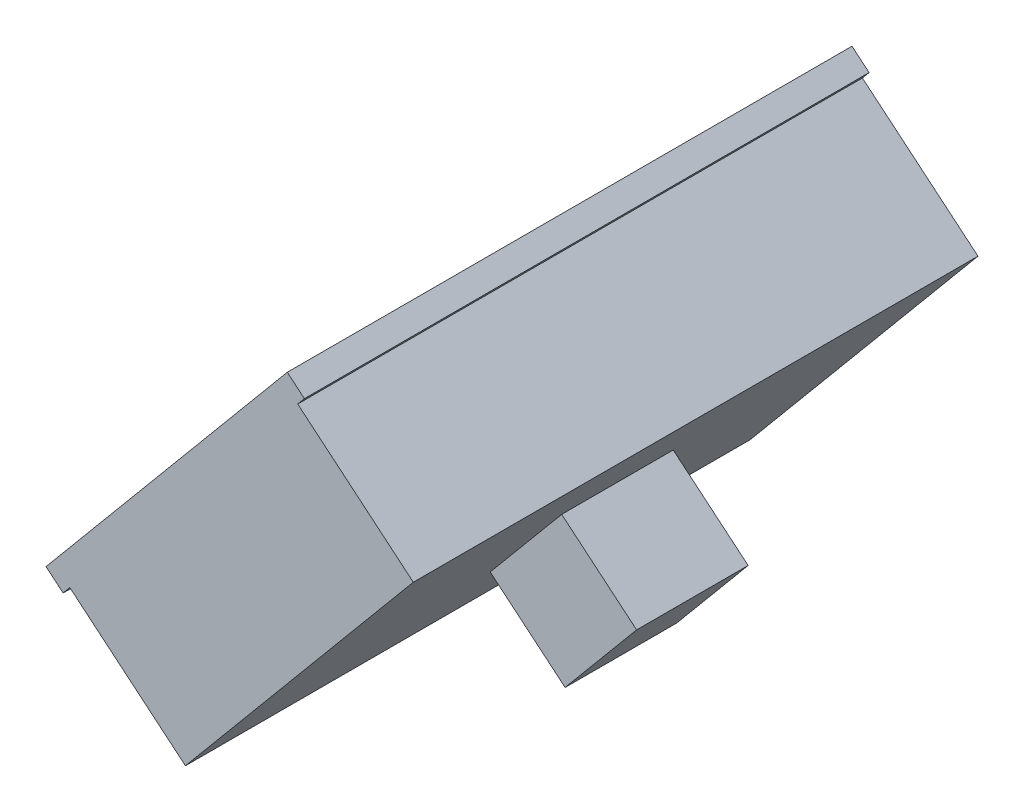
ISO-10303-21;
HEADER;
FILE_DESCRIPTION(('STEP AP214'),'2;1');
FILE_NAME('part.step','',(''),(''),'','','');
FILE_SCHEMA(('AUTOMOTIVE_DESIGN { 1 0 10303 214 1 1 1 1 }'));
ENDSEC;
DATA;
#1=APPLICATION_CONTEXT('core data for automotive mechanical design processes');
#2=APPLICATION_PROTOCOL_DEFINITION('international standard','automotive_design',2000,#1);
#3=PRODUCT_CONTEXT('',#1,'mechanical');
#4=PRODUCT('Part','Part','',(#3));
#5=PRODUCT_RELATED_PRODUCT_CATEGORY('part','',(#4));
#6=PRODUCT_DEFINITION_FORMATION('','',#4);
#7=PRODUCT_DEFINITION_CONTEXT('part definition',#1,'design');
#8=PRODUCT_DEFINITION('design','',#6,#7);
#9=PRODUCT_DEFINITION_SHAPE('','',#8);
#10=(LENGTH_UNIT() NAMED_UNIT(*) SI_UNIT(.MILLI.,.METRE.));
#11=(NAMED_UNIT(*) PLANE_ANGLE_UNIT() SI_UNIT($,.RADIAN.));
#12=(NAMED_UNIT(*) SI_UNIT($,.STERADIAN.) SOLID_ANGLE_UNIT());
#13=UNCERTAINTY_MEASURE_WITH_UNIT(LENGTH_MEASURE(1.E-05),#10,'distance_accuracy_value','');
#14=(GEOMETRIC_REPRESENTATION_CONTEXT(3) GLOBAL_UNCERTAINTY_ASSIGNED_CONTEXT((#13)) GLOBAL_UNIT_ASSIGNED_CONTEXT((#10,
#11,#12)) REPRESENTATION_CONTEXT('',''));
#15=CARTESIAN_POINT('',(0.,0.,0.));
#16=DIRECTION('',(0.,0.,1.));
#17=DIRECTION('',(1.,0.,0.));
#18=AXIS2_PLACEMENT_3D('',#15,#16,#17);
#19=CARTESIAN_POINT('',(-105.010455050426,186.771204380733,-87.6));
#20=DIRECTION('',(-0.767591735032728,0.640939098752328,0.));
#21=DIRECTION('',(-0.640939098752328,-0.767591735032728,0.));
#22=AXIS2_PLACEMENT_3D('',#19,#20,#21);
#23=PLANE('',#22);
#24=DIRECTION('',(0.,0.,-1.));
#25=VECTOR('',#24,1.);
#26=CARTESIAN_POINT('',(-121.835106392675,166.621921336124,-87.6));
#27=LINE('',#26,#25);
#28=CARTESIAN_POINT('',(-121.835106392675,166.621921336124,-87.6));
#29=VERTEX_POINT('',#28);
#30=CARTESIAN_POINT('',(-121.835106392675,166.621921336124,-128.1));
#31=VERTEX_POINT('',#30);
#32=EDGE_CURVE('E178',#29,#31,#27,.T.);
#33=ORIENTED_EDGE('',*,*,#32,.F.);
#34=DIRECTION('',(0.640939098752328,0.767591735032728,0.));
#35=VECTOR('',#34,1.);
#36=CARTESIAN_POINT('',(-105.010455050426,186.771204380733,-87.6));
#37=LINE('',#36,#35);
#38=CARTESIAN_POINT('',(-122.315810716739,166.04622753485,-87.6));
#39=VERTEX_POINT('',#38);
#40=EDGE_CURVE('E202',#39,#29,#37,.T.);
#41=ORIENTED_EDGE('',*,*,#40,.F.);
#42=DIRECTION('',(0.,0.,-1.));
#43=VECTOR('',#42,1.);
#44=CARTESIAN_POINT('',(-122.315810716739,166.04622753485,-87.6));
#45=LINE('',#44,#43);
#46=CARTESIAN_POINT('',(-122.315810716739,166.04622753485,-128.1));
#47=VERTEX_POINT('',#46);
#48=EDGE_CURVE('E11',#39,#47,#45,.T.);
#49=ORIENTED_EDGE('',*,*,#48,.T.);
#50=DIRECTION('',(0.640939098752328,0.767591735032728,0.));
#51=VECTOR('',#50,1.);
#52=CARTESIAN_POINT('',(-105.010455050426,186.771204380733,-128.1));
#53=LINE('',#52,#51);
#54=EDGE_CURVE('E213',#47,#31,#53,.T.);
#55=ORIENTED_EDGE('',*,*,#54,.T.);
#56=EDGE_LOOP('',(#33,#41,#49,#55));
#57=FACE_BOUND('',#56,.T.);
#58=ADVANCED_FACE('F43',(#57),#23,.F.);
#59=DIRECTION('',(0.,0.,-1.));
#60=VECTOR('',#59,1.);
#61=CARTESIAN_POINT('',(-105.49115937449,186.195510579459,-87.6));
#62=LINE('',#61,#60);
#63=CARTESIAN_POINT('',(-105.49115937449,186.195510579459,-87.6));
#64=VERTEX_POINT('',#63);
#65=CARTESIAN_POINT('',(-105.49115937449,186.195510579459,-128.1));
#66=VERTEX_POINT('',#65);
#67=EDGE_CURVE('E187',#64,#66,#62,.T.);
#68=ORIENTED_EDGE('',*,*,#67,.T.);
#69=CARTESIAN_POINT('',(-105.010455050426,186.771204380733,-128.1));
#70=VERTEX_POINT('',#69);
#71=EDGE_CURVE('E212',#66,#70,#53,.T.);
#72=ORIENTED_EDGE('',*,*,#71,.T.);
#73=DIRECTION('',(0.,0.,-1.));
#74=VECTOR('',#73,1.);
#75=CARTESIAN_POINT('',(-105.010455050426,186.771204380733,-87.6));
#76=LINE('',#75,#74);
#77=CARTESIAN_POINT('',(-105.010455050426,186.771204380733,-87.6));
#78=VERTEX_POINT('',#77);
#79=EDGE_CURVE('E51',#78,#70,#76,.T.);
#80=ORIENTED_EDGE('',*,*,#79,.F.);
#81=EDGE_CURVE('E200',#64,#78,#37,.T.);
#82=ORIENTED_EDGE('',*,*,#81,.F.);
#83=EDGE_LOOP('',(#68,#72,#80,#82));
#84=FACE_BOUND('',#83,.T.);
#85=ADVANCED_FACE('F247',(#84),#23,.F.);
#86=CARTESIAN_POINT('',(-122.315810716739,166.04622753485,-87.6));
#87=DIRECTION('',(0.64093909875233,0.767591735032726,0.));
#88=DIRECTION('',(-0.767591735032726,0.64093909875233,0.));
#89=AXIS2_PLACEMENT_3D('',#86,#87,#88);
#90=PLANE('',#89);
#91=DIRECTION('',(0.767591735032726,-0.64093909875233,0.));
#92=VECTOR('',#91,1.);
#93=CARTESIAN_POINT('',(-122.315810716739,166.04622753485,-128.1));
#94=LINE('',#93,#92);
#95=CARTESIAN_POINT('',(-123.543957492791,167.071730092853,-128.1));
#96=VERTEX_POINT('',#95);
#97=EDGE_CURVE('E196',#96,#47,#94,.T.);
#98=ORIENTED_EDGE('',*,*,#97,.T.);
#99=ORIENTED_EDGE('',*,*,#48,.F.);
#100=DIRECTION('',(0.767591735032726,-0.64093909875233,0.));
#101=VECTOR('',#100,1.);
#102=CARTESIAN_POINT('',(-122.315810716739,166.04622753485,-87.6));
#103=LINE('',#102,#101);
#104=CARTESIAN_POINT('',(-123.543957492791,167.071730092853,-87.6));
#105=VERTEX_POINT('',#104);
#106=EDGE_CURVE('E197',#105,#39,#103,.T.);
#107=ORIENTED_EDGE('',*,*,#106,.F.);
#108=DIRECTION('',(0.,0.,-1.));
#109=VECTOR('',#108,1.);
#110=CARTESIAN_POINT('',(-123.543957492791,167.071730092853,-87.6));
#111=LINE('',#110,#109);
#112=EDGE_CURVE('E209',#105,#96,#111,.T.);
#113=ORIENTED_EDGE('',*,*,#112,.T.);
#114=EDGE_LOOP('',(#98,#99,#107,#113));
#115=FACE_BOUND('',#114,.T.);
#116=ADVANCED_FACE('F45',(#115),#90,.F.);
#117=CARTESIAN_POINT('',(-106.238601826479,187.796706938737,-87.6));
#118=DIRECTION('',(-0.640939098752334,-0.767591735032723,0.));
#119=DIRECTION('',(0.767591735032723,-0.640939098752334,0.));
#120=AXIS2_PLACEMENT_3D('',#117,#118,#119);
#121=PLANE('',#120);
#122=DIRECTION('',(-0.767591735032723,0.640939098752334,0.));
#123=VECTOR('',#122,1.);
#124=CARTESIAN_POINT('',(-106.238601826479,187.796706938737,-128.1));
#125=LINE('',#124,#123);
#126=CARTESIAN_POINT('',(-106.238601826479,187.796706938737,-128.1));
#127=VERTEX_POINT('',#126);
#128=EDGE_CURVE('E215',#70,#127,#125,.T.);
#129=ORIENTED_EDGE('',*,*,#128,.T.);
#130=DIRECTION('',(0.,0.,-1.));
#131=VECTOR('',#130,1.);
#132=CARTESIAN_POINT('',(-106.238601826479,187.796706938737,-87.6));
#133=LINE('',#132,#131);
#134=CARTESIAN_POINT('',(-106.238601826479,187.796706938737,-87.6));
#135=VERTEX_POINT('',#134);
#136=EDGE_CURVE('E220',#135,#127,#133,.T.);
#137=ORIENTED_EDGE('',*,*,#136,.F.);
#138=DIRECTION('',(-0.767591735032723,0.640939098752334,0.));
#139=VECTOR('',#138,1.);
#140=CARTESIAN_POINT('',(-106.238601826479,187.796706938737,-87.6));
#141=LINE('',#140,#139);
#142=EDGE_CURVE('E205',#78,#135,#141,.T.);
#143=ORIENTED_EDGE('',*,*,#142,.F.);
#144=ORIENTED_EDGE('',*,*,#79,.T.);
#145=EDGE_LOOP('',(#129,#137,#143,#144));
#146=FACE_BOUND('',#145,.T.);
#147=ADVANCED_FACE('F227',(#146),#121,.F.);
#148=CARTESIAN_POINT('',(-123.543957492791,167.071730092853,-87.6));
#149=DIRECTION('',(0.767591735032727,-0.640939098752329,0.));
#150=DIRECTION('',(0.640939098752329,0.767591735032727,0.));
#151=AXIS2_PLACEMENT_3D('',#148,#149,#150);
#152=PLANE('',#151);
#153=DIRECTION('',(-0.640939098752329,-0.767591735032727,0.));
#154=VECTOR('',#153,1.);
#155=CARTESIAN_POINT('',(-123.543957492791,167.071730092853,-128.1));
#156=LINE('',#155,#154);
#157=EDGE_CURVE('E201',#127,#96,#156,.T.);
#158=ORIENTED_EDGE('',*,*,#157,.T.);
#159=ORIENTED_EDGE('',*,*,#112,.F.);
#160=DIRECTION('',(-0.640939098752329,-0.767591735032727,0.));
#161=VECTOR('',#160,1.);
#162=CARTESIAN_POINT('',(-123.543957492791,167.071730092853,-87.6));
#163=LINE('',#162,#161);
#164=EDGE_CURVE('E207',#135,#105,#163,.T.);
#165=ORIENTED_EDGE('',*,*,#164,.F.);
#166=ORIENTED_EDGE('',*,*,#136,.T.);
#167=EDGE_LOOP('',(#158,#159,#165,#166));
#168=FACE_BOUND('',#167,.T.);
#169=ADVANCED_FACE('F237',(#168),#152,.F.);
#170=CARTESIAN_POINT('',(0.,0.,-87.6));
#171=DIRECTION('',(0.,0.,-1.));
#172=DIRECTION('',(-1.,0.,0.));
#173=AXIS2_PLACEMENT_3D('',#170,#171,#172);
#174=PLANE('',#173);
#175=ORIENTED_EDGE('',*,*,#106,.T.);
#176=ORIENTED_EDGE('',*,*,#40,.T.);
#177=DIRECTION('',(0.767591735032728,-0.640939098752328,0.));
#178=VECTOR('',#177,1.);
#179=CARTESIAN_POINT('',(-113.545115654321,159.699779069599,-87.6));
#180=LINE('',#179,#178);
#181=CARTESIAN_POINT('',(-113.545115654321,159.699779069599,-87.6));
#182=VERTEX_POINT('',#181);
#183=EDGE_CURVE('E169',#29,#182,#180,.T.);
#184=ORIENTED_EDGE('',*,*,#183,.T.);
#185=DIRECTION('',(0.640939098752327,0.767591735032729,0.));
#186=VECTOR('',#185,1.);
#187=CARTESIAN_POINT('',(-97.2011686361369,179.273368312934,-87.6));
#188=LINE('',#187,#186);
#189=CARTESIAN_POINT('',(-97.2011686361369,179.273368312934,-87.6));
#190=VERTEX_POINT('',#189);
#191=EDGE_CURVE('E172',#182,#190,#188,.T.);
#192=ORIENTED_EDGE('',*,*,#191,.T.);
#193=DIRECTION('',(-0.767591735032729,0.640939098752327,0.));
#194=VECTOR('',#193,1.);
#195=CARTESIAN_POINT('',(-105.49115937449,186.195510579459,-87.6));
#196=LINE('',#195,#194);
#197=EDGE_CURVE('E175',#190,#64,#196,.T.);
#198=ORIENTED_EDGE('',*,*,#197,.T.);
#199=ORIENTED_EDGE('',*,*,#81,.T.);
#200=ORIENTED_EDGE('',*,*,#142,.T.);
#201=ORIENTED_EDGE('',*,*,#164,.T.);
#202=EDGE_LOOP('',(#175,#176,#184,#192,#198,#199,#200,#201));
#203=FACE_BOUND('',#202,.T.);
#204=ADVANCED_FACE('F243',(#203),#174,.F.);
#205=CARTESIAN_POINT('',(0.,0.,-128.1));
#206=DIRECTION('',(0.,0.,-1.));
#207=DIRECTION('',(-1.,0.,0.));
#208=AXIS2_PLACEMENT_3D('',#205,#206,#207);
#209=PLANE('',#208);
#210=ORIENTED_EDGE('',*,*,#97,.F.);
#211=ORIENTED_EDGE('',*,*,#157,.F.);
#212=ORIENTED_EDGE('',*,*,#128,.F.);
#213=ORIENTED_EDGE('',*,*,#71,.F.);
#214=DIRECTION('',(-0.767591735032729,0.640939098752327,0.));
#215=VECTOR('',#214,1.);
#216=CARTESIAN_POINT('',(-105.49115937449,186.195510579459,-128.1));
#217=LINE('',#216,#215);
#218=CARTESIAN_POINT('',(-97.2011686361369,179.273368312934,-128.1));
#219=VERTEX_POINT('',#218);
#220=EDGE_CURVE('E173',#219,#66,#217,.T.);
#221=ORIENTED_EDGE('',*,*,#220,.F.);
#222=DIRECTION('',(0.640939098752327,0.767591735032729,0.));
#223=VECTOR('',#222,1.);
#224=CARTESIAN_POINT('',(-97.2011686361369,179.273368312934,-128.1));
#225=LINE('',#224,#223);
#226=CARTESIAN_POINT('',(-113.545115654321,159.699779069599,-128.1));
#227=VERTEX_POINT('',#226);
#228=EDGE_CURVE('E181',#227,#219,#225,.T.);
#229=ORIENTED_EDGE('',*,*,#228,.F.);
#230=DIRECTION('',(0.767591735032728,-0.640939098752328,0.));
#231=VECTOR('',#230,1.);
#232=CARTESIAN_POINT('',(-113.545115654321,159.699779069599,-128.1));
#233=LINE('',#232,#231);
#234=EDGE_CURVE('E166',#31,#227,#233,.T.);
#235=ORIENTED_EDGE('',*,*,#234,.F.);
#236=ORIENTED_EDGE('',*,*,#54,.F.);
#237=EDGE_LOOP('',(#210,#211,#212,#213,#221,#229,#235,#236));
#238=FACE_BOUND('',#237,.T.);
#239=ADVANCED_FACE('F233',(#238),#209,.T.);
#240=CARTESIAN_POINT('',(-113.545115654321,159.699779069599,-87.6));
#241=DIRECTION('',(0.640939098752328,0.767591735032728,0.));
#242=DIRECTION('',(-0.767591735032728,0.640939098752328,0.));
#243=AXIS2_PLACEMENT_3D('',#240,#241,#242);
#244=PLANE('',#243);
#245=ORIENTED_EDGE('',*,*,#234,.T.);
#246=DIRECTION('',(0.,0.,-1.));
#247=VECTOR('',#246,1.);
#248=CARTESIAN_POINT('',(-113.545115654321,159.699779069599,-87.6));
#249=LINE('',#248,#247);
#250=EDGE_CURVE('E193',#182,#227,#249,.T.);
#251=ORIENTED_EDGE('',*,*,#250,.F.);
#252=ORIENTED_EDGE('',*,*,#183,.F.);
#253=ORIENTED_EDGE('',*,*,#32,.T.);
#254=EDGE_LOOP('',(#245,#251,#252,#253));
#255=FACE_BOUND('',#254,.T.);
#256=ADVANCED_FACE('F256',(#255),#244,.F.);
#257=CARTESIAN_POINT('',(-97.2011686361369,179.273368312934,-87.6));
#258=DIRECTION('',(-0.767591735032729,0.640939098752327,0.));
#259=DIRECTION('',(-0.640939098752327,-0.767591735032729,0.));
#260=AXIS2_PLACEMENT_3D('',#257,#258,#259);
#261=PLANE('',#260);
#262=DIRECTION('',(0.,0.,1.));
#263=VECTOR('',#262,1.);
#264=CARTESIAN_POINT('',(-102.80938575022,172.556940631397,-111.85));
#265=LINE('',#264,#263);
#266=CARTESIAN_POINT('',(-102.80938575022,172.556940631397,-111.85));
#267=VERTEX_POINT('',#266);
#268=CARTESIAN_POINT('',(-102.80938575022,172.556940631397,-103.85));
#269=VERTEX_POINT('',#268);
#270=EDGE_CURVE('E63',#267,#269,#265,.T.);
#271=ORIENTED_EDGE('',*,*,#270,.F.);
#272=DIRECTION('',(-0.640939098752329,-0.767591735032727,0.));
#273=VECTOR('',#272,1.);
#274=CARTESIAN_POINT('',(-107.936898540238,166.416206751135,-111.85));
#275=LINE('',#274,#273);
#276=CARTESIAN_POINT('',(-107.936898540238,166.416206751135,-111.85));
#277=VERTEX_POINT('',#276);
#278=EDGE_CURVE('E58',#267,#277,#275,.T.);
#279=ORIENTED_EDGE('',*,*,#278,.T.);
#280=DIRECTION('',(0.,0.,1.));
#281=VECTOR('',#280,1.);
#282=CARTESIAN_POINT('',(-107.936898540238,166.416206751135,-111.85));
#283=LINE('',#282,#281);
#284=CARTESIAN_POINT('',(-107.936898540238,166.416206751135,-103.85));
#285=VERTEX_POINT('',#284);
#286=EDGE_CURVE('E151',#277,#285,#283,.T.);
#287=ORIENTED_EDGE('',*,*,#286,.T.);
#288=DIRECTION('',(-0.640939098752329,-0.767591735032727,0.));
#289=VECTOR('',#288,1.);
#290=CARTESIAN_POINT('',(-107.936898540238,166.416206751135,-103.85));
#291=LINE('',#290,#289);
#292=EDGE_CURVE('E152',#269,#285,#291,.T.);
#293=ORIENTED_EDGE('',*,*,#292,.F.);
#294=EDGE_LOOP('',(#271,#279,#287,#293));
#295=FACE_BOUND('',#294,.T.);
#296=ORIENTED_EDGE('',*,*,#228,.T.);
#297=DIRECTION('',(0.,0.,-1.));
#298=VECTOR('',#297,1.);
#299=CARTESIAN_POINT('',(-97.2011686361369,179.273368312934,-87.6));
#300=LINE('',#299,#298);
#301=EDGE_CURVE('E190',#190,#219,#300,.T.);
#302=ORIENTED_EDGE('',*,*,#301,.F.);
#303=ORIENTED_EDGE('',*,*,#191,.F.);
#304=ORIENTED_EDGE('',*,*,#250,.T.);
#305=EDGE_LOOP('',(#296,#302,#303,#304));
#306=FACE_BOUND('',#305,.T.);
#307=ADVANCED_FACE('F254',(#295,#306),#261,.F.);
#308=CARTESIAN_POINT('',(-105.49115937449,186.195510579459,-87.6));
#309=DIRECTION('',(-0.640939098752327,-0.767591735032729,0.));
#310=DIRECTION('',(0.767591735032729,-0.640939098752327,0.));
#311=AXIS2_PLACEMENT_3D('',#308,#309,#310);
#312=PLANE('',#311);
#313=ORIENTED_EDGE('',*,*,#220,.T.);
#314=ORIENTED_EDGE('',*,*,#67,.F.);
#315=ORIENTED_EDGE('',*,*,#197,.F.);
#316=ORIENTED_EDGE('',*,*,#301,.T.);
#317=EDGE_LOOP('',(#313,#314,#315,#316));
#318=FACE_BOUND('',#317,.T.);
#319=ADVANCED_FACE('F249',(#318),#312,.F.);
#320=CARTESIAN_POINT('',(-102.563756395009,161.929633059869,-111.85));
#321=DIRECTION('',(-0.64093909875233,-0.767591735032726,0.));
#322=DIRECTION('',(0.767591735032726,-0.64093909875233,0.));
#323=AXIS2_PLACEMENT_3D('',#320,#321,#322);
#324=PLANE('',#323);
#325=DIRECTION('',(0.767591735032726,-0.64093909875233,0.));
#326=VECTOR('',#325,1.);
#327=CARTESIAN_POINT('',(-102.563756395009,161.929633059869,-103.85));
#328=LINE('',#327,#326);
#329=CARTESIAN_POINT('',(-102.563756395009,161.929633059869,-103.85));
#330=VERTEX_POINT('',#329);
#331=EDGE_CURVE('E160',#285,#330,#328,.T.);
#332=ORIENTED_EDGE('',*,*,#331,.F.);
#333=ORIENTED_EDGE('',*,*,#286,.F.);
#334=DIRECTION('',(0.767591735032726,-0.64093909875233,0.));
#335=VECTOR('',#334,1.);
#336=CARTESIAN_POINT('',(-102.563756395009,161.929633059869,-111.85));
#337=LINE('',#336,#335);
#338=CARTESIAN_POINT('',(-102.563756395009,161.929633059869,-111.85));
#339=VERTEX_POINT('',#338);
#340=EDGE_CURVE('E147',#277,#339,#337,.T.);
#341=ORIENTED_EDGE('',*,*,#340,.T.);
#342=DIRECTION('',(0.,0.,1.));
#343=VECTOR('',#342,1.);
#344=CARTESIAN_POINT('',(-102.563756395009,161.929633059869,-111.85));
#345=LINE('',#344,#343);
#346=EDGE_CURVE('E131',#339,#330,#345,.T.);
#347=ORIENTED_EDGE('',*,*,#346,.T.);
#348=EDGE_LOOP('',(#332,#333,#341,#347));
#349=FACE_BOUND('',#348,.T.);
#350=ADVANCED_FACE('F150',(#349),#324,.T.);
#351=CARTESIAN_POINT('',(-102.80938575022,172.556940631397,-111.85));
#352=DIRECTION('',(0.64093909875233,0.767591735032726,0.));
#353=DIRECTION('',(-0.767591735032726,0.64093909875233,0.));
#354=AXIS2_PLACEMENT_3D('',#351,#352,#353);
#355=PLANE('',#354);
#356=DIRECTION('',(-0.767591735032726,0.64093909875233,0.));
#357=VECTOR('',#356,1.);
#358=CARTESIAN_POINT('',(-102.80938575022,172.556940631397,-103.85));
#359=LINE('',#358,#357);
#360=CARTESIAN_POINT('',(-97.4362436049907,168.070366940131,-103.85));
#361=VERTEX_POINT('',#360);
#362=EDGE_CURVE('E155',#361,#269,#359,.T.);
#363=ORIENTED_EDGE('',*,*,#362,.F.);
#364=DIRECTION('',(0.,0.,1.));
#365=VECTOR('',#364,1.);
#366=CARTESIAN_POINT('',(-97.4362436049907,168.070366940131,-111.85));
#367=LINE('',#366,#365);
#368=CARTESIAN_POINT('',(-97.4362436049907,168.070366940131,-111.85));
#369=VERTEX_POINT('',#368);
#370=EDGE_CURVE('E141',#369,#361,#367,.T.);
#371=ORIENTED_EDGE('',*,*,#370,.F.);
#372=DIRECTION('',(-0.767591735032726,0.64093909875233,0.));
#373=VECTOR('',#372,1.);
#374=CARTESIAN_POINT('',(-102.80938575022,172.556940631397,-111.85));
#375=LINE('',#374,#373);
#376=EDGE_CURVE('E148',#369,#267,#375,.T.);
#377=ORIENTED_EDGE('',*,*,#376,.T.);
#378=ORIENTED_EDGE('',*,*,#270,.T.);
#379=EDGE_LOOP('',(#363,#371,#377,#378));
#380=FACE_BOUND('',#379,.T.);
#381=ADVANCED_FACE('F279',(#380),#355,.T.);
#382=CARTESIAN_POINT('',(-97.4362436049907,168.070366940131,-111.85));
#383=DIRECTION('',(0.767591735032727,-0.640939098752329,0.));
#384=DIRECTION('',(0.640939098752329,0.767591735032727,0.));
#385=AXIS2_PLACEMENT_3D('',#382,#383,#384);
#386=PLANE('',#385);
#387=DIRECTION('',(0.640939098752329,0.767591735032727,0.));
#388=VECTOR('',#387,1.);
#389=CARTESIAN_POINT('',(-97.4362436049907,168.070366940131,-103.85));
#390=LINE('',#389,#388);
#391=EDGE_CURVE('E136',#330,#361,#390,.T.);
#392=ORIENTED_EDGE('',*,*,#391,.F.);
#393=ORIENTED_EDGE('',*,*,#346,.F.);
#394=DIRECTION('',(0.640939098752329,0.767591735032727,0.));
#395=VECTOR('',#394,1.);
#396=CARTESIAN_POINT('',(-97.4362436049907,168.070366940131,-111.85));
#397=LINE('',#396,#395);
#398=EDGE_CURVE('E134',#339,#369,#397,.T.);
#399=ORIENTED_EDGE('',*,*,#398,.T.);
#400=ORIENTED_EDGE('',*,*,#370,.T.);
#401=EDGE_LOOP('',(#392,#393,#399,#400));
#402=FACE_BOUND('',#401,.T.);
#403=ADVANCED_FACE('F133',(#402),#386,.T.);
#404=CARTESIAN_POINT('',(0.,0.,-111.85));
#405=DIRECTION('',(0.,0.,-1.));
#406=DIRECTION('',(-1.,0.,0.));
#407=AXIS2_PLACEMENT_3D('',#404,#405,#406);
#408=PLANE('',#407);
#409=ORIENTED_EDGE('',*,*,#340,.F.);
#410=ORIENTED_EDGE('',*,*,#278,.F.);
#411=ORIENTED_EDGE('',*,*,#376,.F.);
#412=ORIENTED_EDGE('',*,*,#398,.F.);
#413=EDGE_LOOP('',(#409,#410,#411,#412));
#414=FACE_BOUND('',#413,.T.);
#415=ADVANCED_FACE('F146',(#414),#408,.T.);
#416=CARTESIAN_POINT('',(0.,0.,-103.85));
#417=DIRECTION('',(0.,0.,-1.));
#418=DIRECTION('',(-1.,0.,0.));
#419=AXIS2_PLACEMENT_3D('',#416,#417,#418);
#420=PLANE('',#419);
#421=ORIENTED_EDGE('',*,*,#331,.T.);
#422=ORIENTED_EDGE('',*,*,#391,.T.);
#423=ORIENTED_EDGE('',*,*,#362,.T.);
#424=ORIENTED_EDGE('',*,*,#292,.T.);
#425=EDGE_LOOP('',(#421,#422,#423,#424));
#426=FACE_BOUND('',#425,.T.);
#427=ADVANCED_FACE('F285',(#426),#420,.F.);
#428=CLOSED_SHELL('',(#58,#85,#116,#147,#169,#204,#239,#256,#307,#319,#350,#381,#403,#415,#427));
#429=MANIFOLD_SOLID_BREP('B2',#428);
#430=ADVANCED_BREP_SHAPE_REPRESENTATION('',(#18,#429),#14);
#431=SHAPE_DEFINITION_REPRESENTATION(#9,#430);
ENDSEC;
END-ISO-10303-21;
